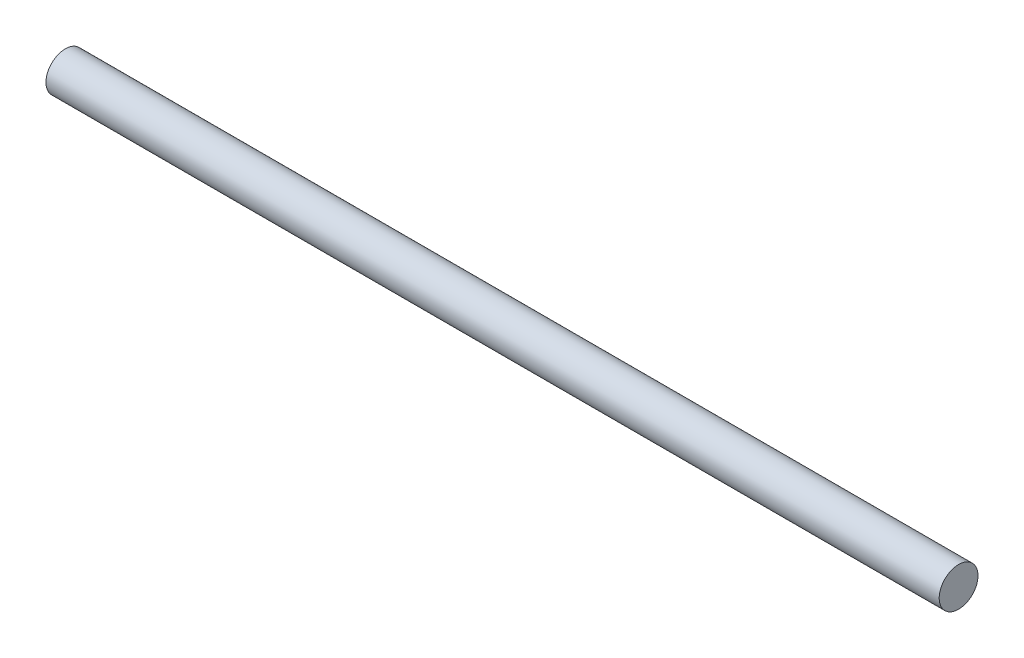
ISO-10303-21;
HEADER;
FILE_DESCRIPTION(('STEP AP214'),'2;1');
FILE_NAME('part.step','',(''),(''),'','','');
FILE_SCHEMA(('AUTOMOTIVE_DESIGN { 1 0 10303 214 1 1 1 1 }'));
ENDSEC;
DATA;
#1=APPLICATION_CONTEXT('core data for automotive mechanical design processes');
#2=APPLICATION_PROTOCOL_DEFINITION('international standard','automotive_design',2000,#1);
#3=PRODUCT_CONTEXT('',#1,'mechanical');
#4=PRODUCT('Part','Part','',(#3));
#5=PRODUCT_RELATED_PRODUCT_CATEGORY('part','',(#4));
#6=PRODUCT_DEFINITION_FORMATION('','',#4);
#7=PRODUCT_DEFINITION_CONTEXT('part definition',#1,'design');
#8=PRODUCT_DEFINITION('design','',#6,#7);
#9=PRODUCT_DEFINITION_SHAPE('','',#8);
#10=(LENGTH_UNIT() NAMED_UNIT(*) SI_UNIT(.MILLI.,.METRE.));
#11=(NAMED_UNIT(*) PLANE_ANGLE_UNIT() SI_UNIT($,.RADIAN.));
#12=(NAMED_UNIT(*) SI_UNIT($,.STERADIAN.) SOLID_ANGLE_UNIT());
#13=UNCERTAINTY_MEASURE_WITH_UNIT(LENGTH_MEASURE(1.E-05),#10,'distance_accuracy_value','');
#14=(GEOMETRIC_REPRESENTATION_CONTEXT(3) GLOBAL_UNCERTAINTY_ASSIGNED_CONTEXT((#13)) GLOBAL_UNIT_ASSIGNED_CONTEXT((#10,
#11,#12)) REPRESENTATION_CONTEXT('',''));
#15=CARTESIAN_POINT('',(0.,0.,0.));
#16=DIRECTION('',(0.,0.,1.));
#17=DIRECTION('',(1.,0.,0.));
#18=AXIS2_PLACEMENT_3D('',#15,#16,#17);
#19=CARTESIAN_POINT('',(13.45,0.,0.));
#20=DIRECTION('',(-1.,0.,0.));
#21=DIRECTION('',(0.,0.,1.));
#22=AXIS2_PLACEMENT_3D('',#19,#20,#21);
#23=CYLINDRICAL_SURFACE('',#22,0.2921);
#24=CARTESIAN_POINT('',(13.45,0.,0.));
#25=DIRECTION('',(1.,0.,0.));
#26=DIRECTION('',(0.,0.,-1.));
#27=AXIS2_PLACEMENT_3D('',#24,#25,#26);
#28=CIRCLE('',#27,0.2921);
#29=CARTESIAN_POINT('',(13.45,0.,-0.2921));
#30=VERTEX_POINT('',#29);
#31=EDGE_CURVE('E10',#30,#30,#28,.T.);
#32=ORIENTED_EDGE('',*,*,#31,.F.);
#33=EDGE_LOOP('',(#32));
#34=FACE_BOUND('',#33,.T.);
#35=CARTESIAN_POINT('',(0.,0.,0.));
#36=DIRECTION('',(1.,0.,0.));
#37=DIRECTION('',(0.,0.,-1.));
#38=AXIS2_PLACEMENT_3D('',#35,#36,#37);
#39=CIRCLE('',#38,0.2921);
#40=CARTESIAN_POINT('',(0.,0.,-0.2921));
#41=VERTEX_POINT('',#40);
#42=EDGE_CURVE('E34',#41,#41,#39,.T.);
#43=ORIENTED_EDGE('',*,*,#42,.T.);
#44=EDGE_LOOP('',(#43));
#45=FACE_BOUND('',#44,.T.);
#46=ADVANCED_FACE('F31',(#34,#45),#23,.T.);
#47=CARTESIAN_POINT('',(13.45,0.,0.));
#48=DIRECTION('',(1.,0.,0.));
#49=DIRECTION('',(0.,0.,-1.));
#50=AXIS2_PLACEMENT_3D('',#47,#48,#49);
#51=PLANE('',#50);
#52=ORIENTED_EDGE('',*,*,#31,.T.);
#53=EDGE_LOOP('',(#52));
#54=FACE_BOUND('',#53,.T.);
#55=ADVANCED_FACE('F46',(#54),#51,.T.);
#56=CARTESIAN_POINT('',(0.,0.,0.));
#57=DIRECTION('',(1.,0.,0.));
#58=DIRECTION('',(0.,0.,-1.));
#59=AXIS2_PLACEMENT_3D('',#56,#57,#58);
#60=PLANE('',#59);
#61=ORIENTED_EDGE('',*,*,#42,.F.);
#62=EDGE_LOOP('',(#61));
#63=FACE_BOUND('',#62,.T.);
#64=ADVANCED_FACE('F44',(#63),#60,.F.);
#65=CLOSED_SHELL('',(#46,#55,#64));
#66=MANIFOLD_SOLID_BREP('B2',#65);
#67=ADVANCED_BREP_SHAPE_REPRESENTATION('',(#18,#66),#14);
#68=SHAPE_DEFINITION_REPRESENTATION(#9,#67);
ENDSEC;
END-ISO-10303-21;
